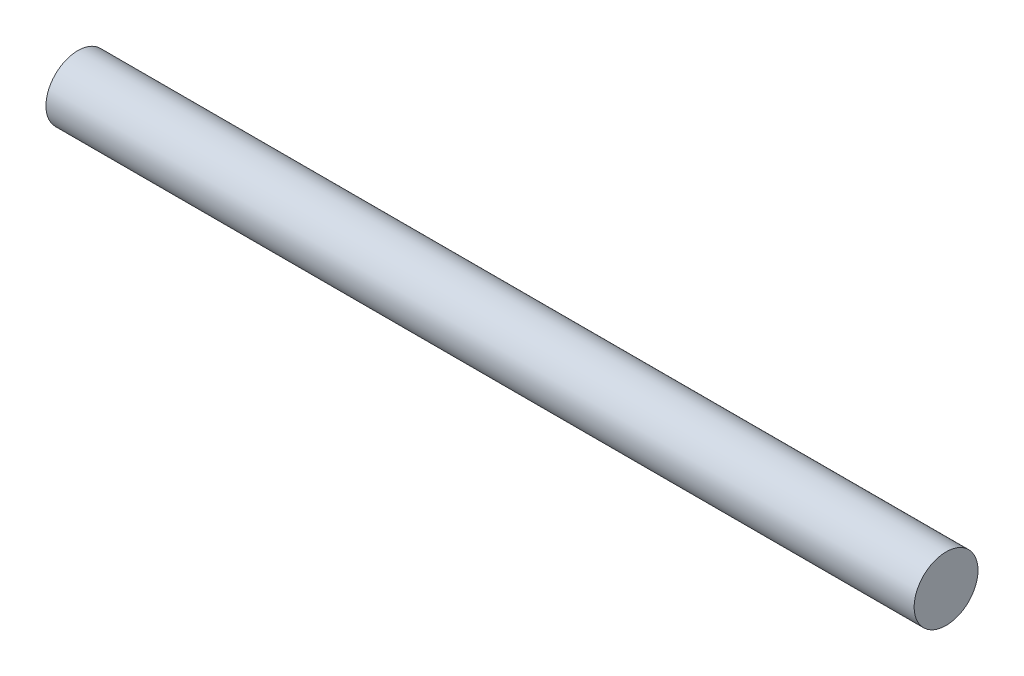
ISO-10303-21;
HEADER;
FILE_DESCRIPTION(('STEP AP214'),'2;1');
FILE_NAME('part.step','',(''),(''),'','','');
FILE_SCHEMA(('AUTOMOTIVE_DESIGN { 1 0 10303 214 1 1 1 1 }'));
ENDSEC;
DATA;
#1=APPLICATION_CONTEXT('core data for automotive mechanical design processes');
#2=APPLICATION_PROTOCOL_DEFINITION('international standard','automotive_design',2000,#1);
#3=PRODUCT_CONTEXT('',#1,'mechanical');
#4=PRODUCT('Part','Part','',(#3));
#5=PRODUCT_RELATED_PRODUCT_CATEGORY('part','',(#4));
#6=PRODUCT_DEFINITION_FORMATION('','',#4);
#7=PRODUCT_DEFINITION_CONTEXT('part definition',#1,'design');
#8=PRODUCT_DEFINITION('design','',#6,#7);
#9=PRODUCT_DEFINITION_SHAPE('','',#8);
#10=(LENGTH_UNIT() NAMED_UNIT(*) SI_UNIT(.MILLI.,.METRE.));
#11=(NAMED_UNIT(*) PLANE_ANGLE_UNIT() SI_UNIT($,.RADIAN.));
#12=(NAMED_UNIT(*) SI_UNIT($,.STERADIAN.) SOLID_ANGLE_UNIT());
#13=UNCERTAINTY_MEASURE_WITH_UNIT(LENGTH_MEASURE(1.E-05),#10,'distance_accuracy_value','');
#14=(GEOMETRIC_REPRESENTATION_CONTEXT(3) GLOBAL_UNCERTAINTY_ASSIGNED_CONTEXT((#13)) GLOBAL_UNIT_ASSIGNED_CONTEXT((#10,
#11,#12)) REPRESENTATION_CONTEXT('',''));
#15=CARTESIAN_POINT('',(0.,0.,0.));
#16=DIRECTION('',(0.,0.,1.));
#17=DIRECTION('',(1.,0.,0.));
#18=AXIS2_PLACEMENT_3D('',#15,#16,#17);
#19=CARTESIAN_POINT('',(34.,0.,0.));
#20=DIRECTION('',(-1.,0.,0.));
#21=DIRECTION('',(0.,0.,1.));
#22=AXIS2_PLACEMENT_3D('',#19,#20,#21);
#23=CYLINDRICAL_SURFACE('',#22,1.25);
#24=CARTESIAN_POINT('',(34.,0.,0.));
#25=DIRECTION('',(1.,0.,0.));
#26=DIRECTION('',(0.,0.,-1.));
#27=AXIS2_PLACEMENT_3D('',#24,#25,#26);
#28=CIRCLE('',#27,1.25);
#29=CARTESIAN_POINT('',(34.,0.,-1.25));
#30=VERTEX_POINT('',#29);
#31=EDGE_CURVE('E10',#30,#30,#28,.T.);
#32=ORIENTED_EDGE('',*,*,#31,.F.);
#33=EDGE_LOOP('',(#32));
#34=FACE_BOUND('',#33,.T.);
#35=CARTESIAN_POINT('',(0.,0.,0.));
#36=DIRECTION('',(1.,0.,0.));
#37=DIRECTION('',(0.,0.,-1.));
#38=AXIS2_PLACEMENT_3D('',#35,#36,#37);
#39=CIRCLE('',#38,1.25);
#40=CARTESIAN_POINT('',(0.,0.,-1.25));
#41=VERTEX_POINT('',#40);
#42=EDGE_CURVE('E37',#41,#41,#39,.T.);
#43=ORIENTED_EDGE('',*,*,#42,.T.);
#44=EDGE_LOOP('',(#43));
#45=FACE_BOUND('',#44,.T.);
#46=ADVANCED_FACE('F34',(#34,#45),#23,.T.);
#47=CARTESIAN_POINT('',(34.,0.,0.));
#48=DIRECTION('',(1.,0.,0.));
#49=DIRECTION('',(0.,0.,-1.));
#50=AXIS2_PLACEMENT_3D('',#47,#48,#49);
#51=PLANE('',#50);
#52=ORIENTED_EDGE('',*,*,#31,.T.);
#53=EDGE_LOOP('',(#52));
#54=FACE_BOUND('',#53,.T.);
#55=ADVANCED_FACE('F49',(#54),#51,.T.);
#56=CARTESIAN_POINT('',(0.,0.,0.));
#57=DIRECTION('',(1.,0.,0.));
#58=DIRECTION('',(0.,0.,-1.));
#59=AXIS2_PLACEMENT_3D('',#56,#57,#58);
#60=PLANE('',#59);
#61=ORIENTED_EDGE('',*,*,#42,.F.);
#62=EDGE_LOOP('',(#61));
#63=FACE_BOUND('',#62,.T.);
#64=ADVANCED_FACE('F47',(#63),#60,.F.);
#65=CLOSED_SHELL('',(#46,#55,#64));
#66=MANIFOLD_SOLID_BREP('B2',#65);
#67=ADVANCED_BREP_SHAPE_REPRESENTATION('',(#18,#66),#14);
#68=SHAPE_DEFINITION_REPRESENTATION(#9,#67);
ENDSEC;
END-ISO-10303-21;
